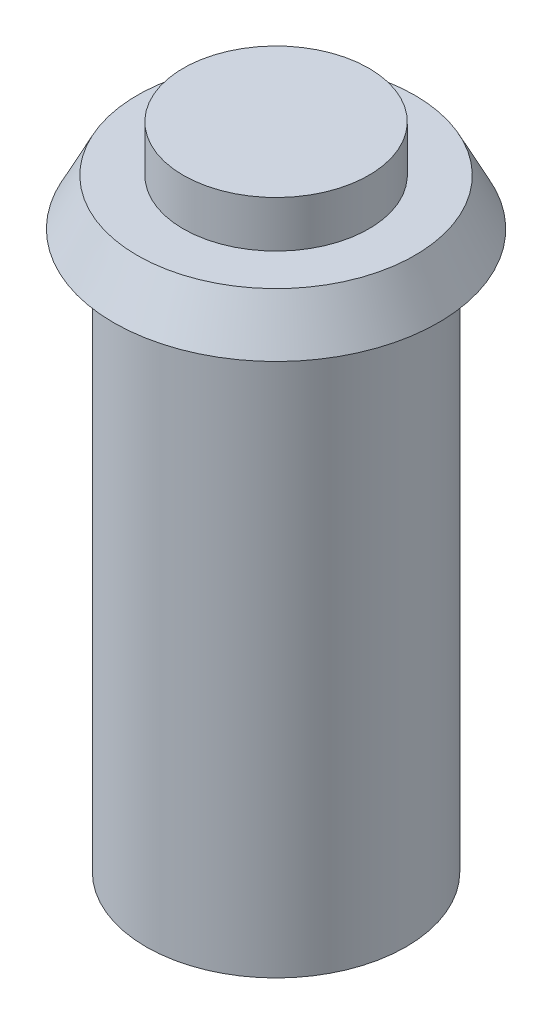
ISO-10303-21;
HEADER;
FILE_DESCRIPTION(('STEP AP214'),'2;1');
FILE_NAME('part.step','',(''),(''),'','','');
FILE_SCHEMA(('AUTOMOTIVE_DESIGN { 1 0 10303 214 1 1 1 1 }'));
ENDSEC;
DATA;
#1=APPLICATION_CONTEXT('core data for automotive mechanical design processes');
#2=APPLICATION_PROTOCOL_DEFINITION('international standard','automotive_design',2000,#1);
#3=PRODUCT_CONTEXT('',#1,'mechanical');
#4=PRODUCT('Part','Part','',(#3));
#5=PRODUCT_RELATED_PRODUCT_CATEGORY('part','',(#4));
#6=PRODUCT_DEFINITION_FORMATION('','',#4);
#7=PRODUCT_DEFINITION_CONTEXT('part definition',#1,'design');
#8=PRODUCT_DEFINITION('design','',#6,#7);
#9=PRODUCT_DEFINITION_SHAPE('','',#8);
#10=(LENGTH_UNIT() NAMED_UNIT(*) SI_UNIT(.MILLI.,.METRE.));
#11=(NAMED_UNIT(*) PLANE_ANGLE_UNIT() SI_UNIT($,.RADIAN.));
#12=(NAMED_UNIT(*) SI_UNIT($,.STERADIAN.) SOLID_ANGLE_UNIT());
#13=UNCERTAINTY_MEASURE_WITH_UNIT(LENGTH_MEASURE(1.E-05),#10,'distance_accuracy_value','');
#14=(GEOMETRIC_REPRESENTATION_CONTEXT(3) GLOBAL_UNCERTAINTY_ASSIGNED_CONTEXT((#13)) GLOBAL_UNIT_ASSIGNED_CONTEXT((#10,
#11,#12)) REPRESENTATION_CONTEXT('',''));
#15=CARTESIAN_POINT('',(0.,0.,0.));
#16=DIRECTION('',(0.,0.,1.));
#17=DIRECTION('',(1.,0.,0.));
#18=AXIS2_PLACEMENT_3D('',#15,#16,#17);
#19=CARTESIAN_POINT('',(0.,28.,0.));
#20=DIRECTION('',(0.,1.,0.));
#21=DIRECTION('',(0.,0.,1.));
#22=AXIS2_PLACEMENT_3D('',#19,#20,#21);
#23=PLANE('',#22);
#24=CARTESIAN_POINT('',(0.,28.,0.));
#25=DIRECTION('',(0.,1.,0.));
#26=DIRECTION('',(0.,0.,1.));
#27=AXIS2_PLACEMENT_3D('',#24,#25,#26);
#28=CIRCLE('',#27,4.);
#29=CARTESIAN_POINT('',(0.,28.,4.));
#30=VERTEX_POINT('',#29);
#31=EDGE_CURVE('E10',#30,#30,#28,.T.);
#32=ORIENTED_EDGE('',*,*,#31,.T.);
#33=EDGE_LOOP('',(#32));
#34=FACE_BOUND('',#33,.T.);
#35=ADVANCED_FACE('F39',(#34),#23,.T.);
#36=CARTESIAN_POINT('',(0.,55.9164179104478,0.));
#37=DIRECTION('',(0.,1.,0.));
#38=DIRECTION('',(0.,0.,1.));
#39=AXIS2_PLACEMENT_3D('',#36,#37,#38);
#40=CYLINDRICAL_SURFACE('',#39,4.);
#41=CARTESIAN_POINT('',(0.,26.,0.));
#42=DIRECTION('',(0.,1.,0.));
#43=DIRECTION('',(0.,0.,1.));
#44=AXIS2_PLACEMENT_3D('',#41,#42,#43);
#45=CIRCLE('',#44,4.);
#46=CARTESIAN_POINT('',(0.,26.,4.));
#47=VERTEX_POINT('',#46);
#48=EDGE_CURVE('E45',#47,#47,#45,.T.);
#49=ORIENTED_EDGE('',*,*,#48,.T.);
#50=EDGE_LOOP('',(#49));
#51=FACE_BOUND('',#50,.T.);
#52=ORIENTED_EDGE('',*,*,#31,.F.);
#53=EDGE_LOOP('',(#52));
#54=FACE_BOUND('',#53,.T.);
#55=ADVANCED_FACE('F77',(#51,#54),#40,.T.);
#56=CARTESIAN_POINT('',(-5.98120276138286,26.,0.));
#57=DIRECTION('',(0.,1.,0.));
#58=DIRECTION('',(0.,0.,1.));
#59=AXIS2_PLACEMENT_3D('',#56,#57,#58);
#60=PLANE('',#59);
#61=CARTESIAN_POINT('',(0.,26.,0.));
#62=DIRECTION('',(0.,1.,0.));
#63=DIRECTION('',(0.,0.,1.));
#64=AXIS2_PLACEMENT_3D('',#61,#62,#63);
#65=CIRCLE('',#64,5.98120276138286);
#66=CARTESIAN_POINT('',(0.,26.,5.98120276138286));
#67=VERTEX_POINT('',#66);
#68=EDGE_CURVE('E49',#67,#67,#65,.T.);
#69=ORIENTED_EDGE('',*,*,#68,.T.);
#70=EDGE_LOOP('',(#69));
#71=FACE_BOUND('',#70,.T.);
#72=ORIENTED_EDGE('',*,*,#48,.F.);
#73=EDGE_LOOP('',(#72));
#74=FACE_BOUND('',#73,.T.);
#75=ADVANCED_FACE('F81',(#71,#74),#60,.T.);
#76=CARTESIAN_POINT('',(0.,26.,0.));
#77=DIRECTION('',(0.,-1.,0.));
#78=DIRECTION('',(0.,0.,-1.));
#79=AXIS2_PLACEMENT_3D('',#76,#77,#78);
#80=CONICAL_SURFACE('',#79,5.98120276138286,0.471138203323449);
#81=CARTESIAN_POINT('',(0.,24.,0.));
#82=DIRECTION('',(0.,1.,0.));
#83=DIRECTION('',(0.,0.,1.));
#84=AXIS2_PLACEMENT_3D('',#81,#82,#83);
#85=CIRCLE('',#84,7.);
#86=CARTESIAN_POINT('',(0.,24.,7.));
#87=VERTEX_POINT('',#86);
#88=EDGE_CURVE('E53',#87,#87,#85,.T.);
#89=ORIENTED_EDGE('',*,*,#88,.T.);
#90=EDGE_LOOP('',(#89));
#91=FACE_BOUND('',#90,.T.);
#92=ORIENTED_EDGE('',*,*,#68,.F.);
#93=EDGE_LOOP('',(#92));
#94=FACE_BOUND('',#93,.T.);
#95=ADVANCED_FACE('F85',(#91,#94),#80,.T.);
#96=CARTESIAN_POINT('',(-7.,24.,0.));
#97=DIRECTION('',(0.,-1.,0.));
#98=DIRECTION('',(0.,0.,-1.));
#99=AXIS2_PLACEMENT_3D('',#96,#97,#98);
#100=PLANE('',#99);
#101=CARTESIAN_POINT('',(0.,24.,0.));
#102=DIRECTION('',(0.,1.,0.));
#103=DIRECTION('',(0.,0.,1.));
#104=AXIS2_PLACEMENT_3D('',#101,#102,#103);
#105=CIRCLE('',#104,5.6);
#106=CARTESIAN_POINT('',(0.,24.,5.6));
#107=VERTEX_POINT('',#106);
#108=EDGE_CURVE('E58',#107,#107,#105,.T.);
#109=ORIENTED_EDGE('',*,*,#108,.T.);
#110=EDGE_LOOP('',(#109));
#111=FACE_BOUND('',#110,.T.);
#112=ORIENTED_EDGE('',*,*,#88,.F.);
#113=EDGE_LOOP('',(#112));
#114=FACE_BOUND('',#113,.T.);
#115=ADVANCED_FACE('F74',(#111,#114),#100,.T.);
#116=CARTESIAN_POINT('',(0.,55.9164179104478,0.));
#117=DIRECTION('',(0.,1.,0.));
#118=DIRECTION('',(0.,0.,1.));
#119=AXIS2_PLACEMENT_3D('',#116,#117,#118);
#120=CYLINDRICAL_SURFACE('',#119,5.59999999999999);
#121=CARTESIAN_POINT('',(0.,0.,0.));
#122=DIRECTION('',(0.,1.,0.));
#123=DIRECTION('',(0.,0.,1.));
#124=AXIS2_PLACEMENT_3D('',#121,#122,#123);
#125=CIRCLE('',#124,5.59999999999999);
#126=CARTESIAN_POINT('',(0.,0.,5.59999999999999));
#127=VERTEX_POINT('',#126);
#128=EDGE_CURVE('E61',#127,#127,#125,.T.);
#129=ORIENTED_EDGE('',*,*,#128,.T.);
#130=EDGE_LOOP('',(#129));
#131=FACE_BOUND('',#130,.T.);
#132=ORIENTED_EDGE('',*,*,#108,.F.);
#133=EDGE_LOOP('',(#132));
#134=FACE_BOUND('',#133,.T.);
#135=ADVANCED_FACE('F65',(#131,#134),#120,.T.);
#136=CARTESIAN_POINT('',(-5.59999999999999,0.,0.));
#137=DIRECTION('',(0.,-1.,0.));
#138=DIRECTION('',(0.,0.,-1.));
#139=AXIS2_PLACEMENT_3D('',#136,#137,#138);
#140=PLANE('',#139);
#141=ORIENTED_EDGE('',*,*,#128,.F.);
#142=EDGE_LOOP('',(#141));
#143=FACE_BOUND('',#142,.T.);
#144=ADVANCED_FACE('F68',(#143),#140,.T.);
#145=CLOSED_SHELL('',(#35,#55,#75,#95,#115,#135,#144));
#146=MANIFOLD_SOLID_BREP('B2',#145);
#147=ADVANCED_BREP_SHAPE_REPRESENTATION('',(#18,#146),#14);
#148=SHAPE_DEFINITION_REPRESENTATION(#9,#147);
ENDSEC;
END-ISO-10303-21;
